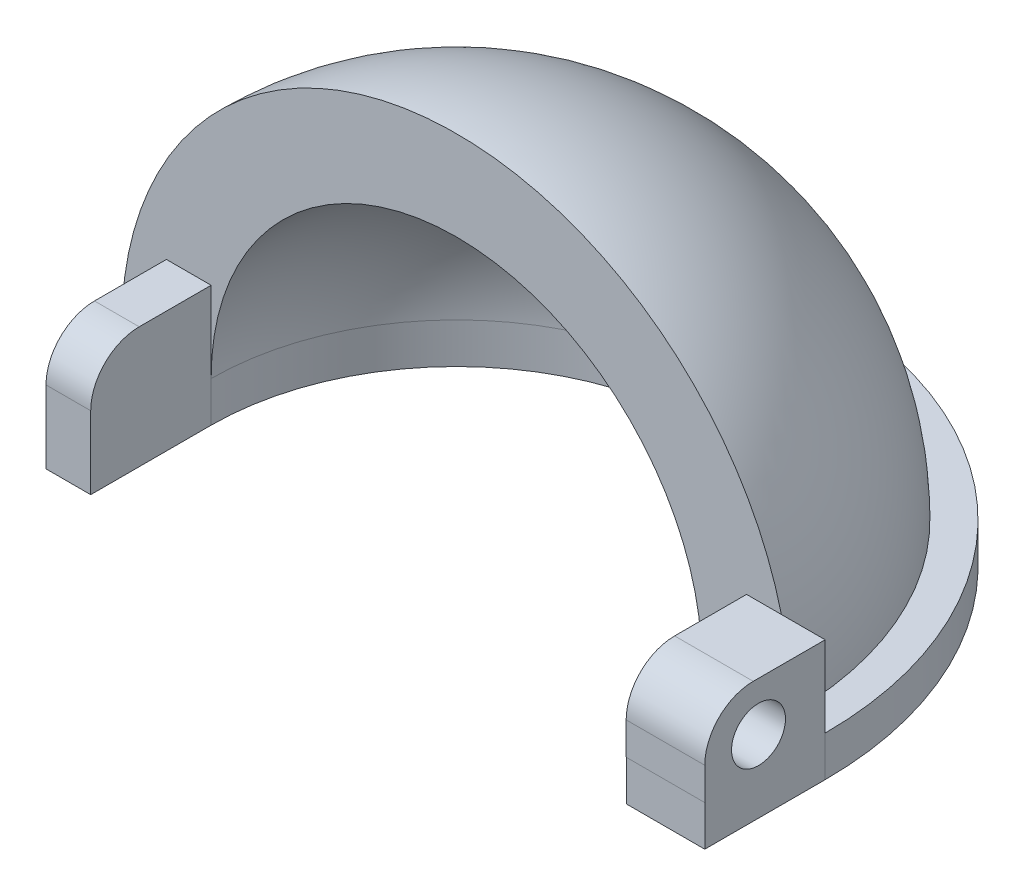
ISO-10303-21;
HEADER;
FILE_DESCRIPTION(('STEP AP214'),'2;1');
FILE_NAME('part.step','',(''),(''),'','','');
FILE_SCHEMA(('AUTOMOTIVE_DESIGN { 1 0 10303 214 1 1 1 1 }'));
ENDSEC;
DATA;
#1=APPLICATION_CONTEXT('core data for automotive mechanical design processes');
#2=APPLICATION_PROTOCOL_DEFINITION('international standard','automotive_design',2000,#1);
#3=PRODUCT_CONTEXT('',#1,'mechanical');
#4=PRODUCT('Part','Part','',(#3));
#5=PRODUCT_RELATED_PRODUCT_CATEGORY('part','',(#4));
#6=PRODUCT_DEFINITION_FORMATION('','',#4);
#7=PRODUCT_DEFINITION_CONTEXT('part definition',#1,'design');
#8=PRODUCT_DEFINITION('design','',#6,#7);
#9=PRODUCT_DEFINITION_SHAPE('','',#8);
#10=(LENGTH_UNIT() NAMED_UNIT(*) SI_UNIT(.MILLI.,.METRE.));
#11=(NAMED_UNIT(*) PLANE_ANGLE_UNIT() SI_UNIT($,.RADIAN.));
#12=(NAMED_UNIT(*) SI_UNIT($,.STERADIAN.) SOLID_ANGLE_UNIT());
#13=UNCERTAINTY_MEASURE_WITH_UNIT(LENGTH_MEASURE(1.E-05),#10,'distance_accuracy_value','');
#14=(GEOMETRIC_REPRESENTATION_CONTEXT(3) GLOBAL_UNCERTAINTY_ASSIGNED_CONTEXT((#13)) GLOBAL_UNIT_ASSIGNED_CONTEXT((#10,
#11,#12)) REPRESENTATION_CONTEXT('',''));
#15=CARTESIAN_POINT('',(0.,0.,0.));
#16=DIRECTION('',(0.,0.,1.));
#17=DIRECTION('',(1.,0.,0.));
#18=AXIS2_PLACEMENT_3D('',#15,#16,#17);
#19=CARTESIAN_POINT('',(0.,4.572,4.52200274069132));
#20=DIRECTION('',(-1.,0.,0.));
#21=DIRECTION('',(0.,0.,1.));
#22=AXIS2_PLACEMENT_3D('',#19,#20,#21);
#23=CYLINDRICAL_SURFACE('',#22,3.048);
#24=DIRECTION('',(-1.,0.,0.));
#25=VECTOR('',#24,1.);
#26=CARTESIAN_POINT('',(0.,4.572,7.57000274069132));
#27=LINE('',#26,#25);
#28=CARTESIAN_POINT('',(7.81129479264564,4.572,7.57000274069132));
#29=VERTEX_POINT('',#28);
#30=CARTESIAN_POINT('',(4.99931890190691,4.572,7.57000274069132));
#31=VERTEX_POINT('',#30);
#32=EDGE_CURVE('E162',#29,#31,#27,.T.);
#33=ORIENTED_EDGE('',*,*,#32,.F.);
#34=CARTESIAN_POINT('',(7.81129479264564,4.572,4.52200274069132));
#35=DIRECTION('',(-1.,0.,0.));
#36=DIRECTION('',(0.,0.,1.));
#37=AXIS2_PLACEMENT_3D('',#34,#35,#36);
#38=CIRCLE('',#37,3.048);
#39=CARTESIAN_POINT('',(7.81129479264564,7.62,4.52200274069132));
#40=VERTEX_POINT('',#39);
#41=EDGE_CURVE('E42',#40,#29,#38,.F.);
#42=ORIENTED_EDGE('',*,*,#41,.F.);
#43=DIRECTION('',(-1.,0.,0.));
#44=VECTOR('',#43,1.);
#45=CARTESIAN_POINT('',(0.,7.62,4.52200274069132));
#46=LINE('',#45,#44);
#47=CARTESIAN_POINT('',(4.99931890190691,7.62,4.52200274069132));
#48=VERTEX_POINT('',#47);
#49=EDGE_CURVE('E228',#48,#40,#46,.F.);
#50=ORIENTED_EDGE('',*,*,#49,.F.);
#51=CARTESIAN_POINT('',(4.99931890190691,4.572,4.52200274069132));
#52=DIRECTION('',(1.,0.,0.));
#53=DIRECTION('',(0.,0.,-1.));
#54=AXIS2_PLACEMENT_3D('',#51,#52,#53);
#55=CIRCLE('',#54,3.048);
#56=EDGE_CURVE('E11',#31,#48,#55,.F.);
#57=ORIENTED_EDGE('',*,*,#56,.F.);
#58=EDGE_LOOP('',(#33,#42,#50,#57));
#59=FACE_BOUND('',#58,.T.);
#60=ADVANCED_FACE('F35',(#59),#23,.T.);
#61=CARTESIAN_POINT('',(0.,7.62,0.));
#62=DIRECTION('',(0.,-1.,0.));
#63=DIRECTION('',(0.,0.,-1.));
#64=AXIS2_PLACEMENT_3D('',#61,#62,#63);
#65=PLANE('',#64);
#66=DIRECTION('',(0.,0.,-1.));
#67=VECTOR('',#66,1.);
#68=CARTESIAN_POINT('',(4.99931890190691,7.62,7.57000274069132));
#69=LINE('',#68,#67);
#70=CARTESIAN_POINT('',(4.99931890190691,7.62,0.));
#71=VERTEX_POINT('',#70);
#72=EDGE_CURVE('E239',#48,#71,#69,.T.);
#73=ORIENTED_EDGE('',*,*,#72,.F.);
#74=ORIENTED_EDGE('',*,*,#49,.T.);
#75=DIRECTION('',(0.,0.,-1.));
#76=VECTOR('',#75,1.);
#77=CARTESIAN_POINT('',(7.81129479264564,7.62,7.57000274069132));
#78=LINE('',#77,#76);
#79=CARTESIAN_POINT('',(7.81129479264564,7.62,1.22670333591582E-12));
#80=VERTEX_POINT('',#79);
#81=EDGE_CURVE('E233',#40,#80,#78,.T.);
#82=ORIENTED_EDGE('',*,*,#81,.T.);
#83=DIRECTION('',(-1.,0.,0.));
#84=VECTOR('',#83,1.);
#85=CARTESIAN_POINT('',(4.99931890190692,7.62,0.));
#86=LINE('',#85,#84);
#87=EDGE_CURVE('E277',#80,#71,#86,.T.);
#88=ORIENTED_EDGE('',*,*,#87,.T.);
#89=EDGE_LOOP('',(#73,#74,#82,#88));
#90=FACE_BOUND('',#89,.T.);
#91=ADVANCED_FACE('F381',(#90),#65,.F.);
#92=CARTESIAN_POINT('',(23.2385388906228,2.54000000000064,6.34041430469523E-13));
#93=DIRECTION('',(0.,0.,-1.));
#94=DIRECTION('',(0.,1.,0.));
#95=AXIS2_PLACEMENT_3D('',#92,#93,#94);
#96=PLANE('',#95);
#97=DIRECTION('',(0.,1.,0.));
#98=VECTOR('',#97,1.);
#99=CARTESIAN_POINT('',(7.81129479264564,2.54000000000064,1.11759969667996E-12));
#100=LINE('',#99,#98);
#101=CARTESIAN_POINT('',(7.81129479264564,2.54,6.34041430469523E-13));
#102=VERTEX_POINT('',#101);
#103=EDGE_CURVE('E243',#102,#80,#100,.T.);
#104=ORIENTED_EDGE('',*,*,#103,.F.);
#105=CARTESIAN_POINT('',(23.2380511651513,2.54000000000064,6.34041430469523E-13));
#106=DIRECTION('',(0.,0.,-1.));
#107=DIRECTION('',(0.,-1.,0.));
#108=AXIS2_PLACEMENT_3D('',#105,#106,#107);
#109=CIRCLE('',#108,15.4267563725057);
#110=CARTESIAN_POINT('',(38.664807537657,2.54,6.34041430469523E-13));
#111=VERTEX_POINT('',#110);
#112=EDGE_CURVE('E308',#102,#111,#109,.T.);
#113=ORIENTED_EDGE('',*,*,#112,.T.);
#114=DIRECTION('',(1.,0.,0.));
#115=VECTOR('',#114,1.);
#116=CARTESIAN_POINT('',(38.664807537657,2.54,1.50487261540988E-13));
#117=LINE('',#116,#115);
#118=CARTESIAN_POINT('',(41.4772711538672,2.54,0.));
#119=VERTEX_POINT('',#118);
#120=EDGE_CURVE('E187',#111,#119,#117,.T.);
#121=ORIENTED_EDGE('',*,*,#120,.T.);
#122=DIRECTION('',(0.,-1.,0.));
#123=VECTOR('',#122,1.);
#124=CARTESIAN_POINT('',(41.4772711538672,7.62,0.));
#125=LINE('',#124,#123);
#126=CARTESIAN_POINT('',(41.4772711538672,7.62,0.));
#127=VERTEX_POINT('',#126);
#128=EDGE_CURVE('E296',#127,#119,#125,.T.);
#129=ORIENTED_EDGE('',*,*,#128,.F.);
#130=DIRECTION('',(1.,0.,0.));
#131=VECTOR('',#130,1.);
#132=CARTESIAN_POINT('',(23.2385388906228,7.62,7.43145069705384E-13));
#133=LINE('',#132,#131);
#134=CARTESIAN_POINT('',(43.6675978007922,7.62,1.02807738930427E-13));
#135=VERTEX_POINT('',#134);
#136=EDGE_CURVE('E209',#127,#135,#133,.T.);
#137=ORIENTED_EDGE('',*,*,#136,.T.);
#138=CARTESIAN_POINT('',(23.2385388906228,2.54000000000064,6.34041430469523E-13));
#139=DIRECTION('',(0.,0.,1.));
#140=DIRECTION('',(0.,1.,0.));
#141=AXIS2_PLACEMENT_3D('',#138,#139,#140);
#142=CIRCLE('',#141,21.0511958794546);
#143=CARTESIAN_POINT('',(2.18734301116819,2.54,0.));
#144=VERTEX_POINT('',#143);
#145=EDGE_CURVE('E304',#135,#144,#142,.T.);
#146=ORIENTED_EDGE('',*,*,#145,.T.);
#147=DIRECTION('',(-1.,0.,0.));
#148=VECTOR('',#147,1.);
#149=CARTESIAN_POINT('',(4.99931890190692,2.54,0.));
#150=LINE('',#149,#148);
#151=CARTESIAN_POINT('',(0.,2.54,0.));
#152=VERTEX_POINT('',#151);
#153=EDGE_CURVE('E276',#144,#152,#150,.T.);
#154=ORIENTED_EDGE('',*,*,#153,.T.);
#155=DIRECTION('',(0.,-1.,0.));
#156=VECTOR('',#155,1.);
#157=CARTESIAN_POINT('',(0.,2.54,0.));
#158=LINE('',#157,#156);
#159=CARTESIAN_POINT('',(0.,0.,0.));
#160=VERTEX_POINT('',#159);
#161=EDGE_CURVE('E207',#152,#160,#158,.T.);
#162=ORIENTED_EDGE('',*,*,#161,.T.);
#163=DIRECTION('',(-1.,0.,0.));
#164=VECTOR('',#163,1.);
#165=CARTESIAN_POINT('',(0.,0.,0.));
#166=LINE('',#165,#164);
#167=CARTESIAN_POINT('',(4.99931890190691,0.,0.));
#168=VERTEX_POINT('',#167);
#169=EDGE_CURVE('E174',#168,#160,#166,.T.);
#170=ORIENTED_EDGE('',*,*,#169,.F.);
#171=DIRECTION('',(0.,1.,0.));
#172=VECTOR('',#171,1.);
#173=CARTESIAN_POINT('',(4.99931890190691,0.,0.));
#174=LINE('',#173,#172);
#175=EDGE_CURVE('E170',#168,#71,#174,.T.);
#176=ORIENTED_EDGE('',*,*,#175,.T.);
#177=ORIENTED_EDGE('',*,*,#87,.F.);
#178=EDGE_LOOP('',(#104,#113,#121,#129,#137,#146,#154,#162,#170,#176,#177));
#179=FACE_BOUND('',#178,.T.);
#180=ADVANCED_FACE('F323',(#179),#96,.F.);
#181=CARTESIAN_POINT('',(38.664807537657,4.572,4.52200274069132));
#182=DIRECTION('',(1.,0.,0.));
#183=DIRECTION('',(0.,0.,-1.));
#184=AXIS2_PLACEMENT_3D('',#181,#182,#183);
#185=CYLINDRICAL_SURFACE('',#184,3.048);
#186=DIRECTION('',(-1.,0.,0.));
#187=VECTOR('',#186,1.);
#188=CARTESIAN_POINT('',(38.664807537657,4.572,7.57000274069132));
#189=LINE('',#188,#187);
#190=CARTESIAN_POINT('',(46.4199382394668,4.572,7.57000274069132));
#191=VERTEX_POINT('',#190);
#192=CARTESIAN_POINT('',(41.4772711538672,4.572,7.57000274069132));
#193=VERTEX_POINT('',#192);
#194=EDGE_CURVE('E217',#191,#193,#189,.T.);
#195=ORIENTED_EDGE('',*,*,#194,.F.);
#196=CARTESIAN_POINT('',(46.4199382394668,4.572,4.52200274069132));
#197=DIRECTION('',(-1.,0.,0.));
#198=DIRECTION('',(0.,0.,1.));
#199=AXIS2_PLACEMENT_3D('',#196,#197,#198);
#200=CIRCLE('',#199,3.048);
#201=CARTESIAN_POINT('',(46.4199382394668,7.62,4.52200274069132));
#202=VERTEX_POINT('',#201);
#203=EDGE_CURVE('E223',#202,#191,#200,.F.);
#204=ORIENTED_EDGE('',*,*,#203,.F.);
#205=DIRECTION('',(-1.,0.,0.));
#206=VECTOR('',#205,1.);
#207=CARTESIAN_POINT('',(38.664807537657,7.62,4.52200274069132));
#208=LINE('',#207,#206);
#209=CARTESIAN_POINT('',(41.4772711538672,7.62,4.52200274069132));
#210=VERTEX_POINT('',#209);
#211=EDGE_CURVE('E220',#210,#202,#208,.F.);
#212=ORIENTED_EDGE('',*,*,#211,.F.);
#213=CARTESIAN_POINT('',(41.4772711538672,4.572,4.52200274069132));
#214=DIRECTION('',(1.,0.,0.));
#215=DIRECTION('',(0.,0.,-1.));
#216=AXIS2_PLACEMENT_3D('',#213,#214,#215);
#217=CIRCLE('',#216,3.048);
#218=EDGE_CURVE('E225',#193,#210,#217,.F.);
#219=ORIENTED_EDGE('',*,*,#218,.F.);
#220=EDGE_LOOP('',(#195,#204,#212,#219));
#221=FACE_BOUND('',#220,.T.);
#222=ADVANCED_FACE('F390',(#221),#185,.T.);
#223=CARTESIAN_POINT('',(38.664807537657,2.54,7.57000274069132));
#224=DIRECTION('',(0.,0.,-1.));
#225=DIRECTION('',(-1.,0.,0.));
#226=AXIS2_PLACEMENT_3D('',#223,#224,#225);
#227=PLANE('',#226);
#228=DIRECTION('',(1.,0.,0.));
#229=VECTOR('',#228,1.);
#230=CARTESIAN_POINT('',(38.664807537657,2.54,7.57000274069132));
#231=LINE('',#230,#229);
#232=CARTESIAN_POINT('',(41.4977628366429,2.54,7.57000274069132));
#233=VERTEX_POINT('',#232);
#234=CARTESIAN_POINT('',(46.4199382394668,2.54,7.57000274069132));
#235=VERTEX_POINT('',#234);
#236=EDGE_CURVE('E212',#233,#235,#231,.T.);
#237=ORIENTED_EDGE('',*,*,#236,.F.);
#238=DIRECTION('',(0.,1.,0.));
#239=VECTOR('',#238,1.);
#240=CARTESIAN_POINT('',(41.4977628366429,2.54,7.57000274069132));
#241=LINE('',#240,#239);
#242=CARTESIAN_POINT('',(41.4977628366429,0.,7.57000274069132));
#243=VERTEX_POINT('',#242);
#244=EDGE_CURVE('E245',#243,#233,#241,.T.);
#245=ORIENTED_EDGE('',*,*,#244,.F.);
#246=DIRECTION('',(1.,0.,0.));
#247=VECTOR('',#246,1.);
#248=CARTESIAN_POINT('',(38.664807537657,0.,7.57000274069132));
#249=LINE('',#248,#247);
#250=CARTESIAN_POINT('',(46.4199382394668,0.,7.57000274069132));
#251=VERTEX_POINT('',#250);
#252=EDGE_CURVE('E184',#243,#251,#249,.T.);
#253=ORIENTED_EDGE('',*,*,#252,.T.);
#254=DIRECTION('',(0.,-1.,0.));
#255=VECTOR('',#254,1.);
#256=CARTESIAN_POINT('',(46.4199382394668,2.54,7.57000274069132));
#257=LINE('',#256,#255);
#258=EDGE_CURVE('E198',#235,#251,#257,.T.);
#259=ORIENTED_EDGE('',*,*,#258,.F.);
#260=EDGE_LOOP('',(#237,#245,#253,#259));
#261=FACE_BOUND('',#260,.T.);
#262=ADVANCED_FACE('F368',(#261),#227,.F.);
#263=CARTESIAN_POINT('',(23.2099691197334,2.54,0.));
#264=DIRECTION('',(0.,-1.,0.));
#265=DIRECTION('',(0.,0.,-1.));
#266=AXIS2_PLACEMENT_3D('',#263,#264,#265);
#267=PLANE('',#266);
#268=ORIENTED_EDGE('',*,*,#153,.F.);
#269=CARTESIAN_POINT('',(23.2385388906228,2.54,0.));
#270=DIRECTION('',(0.,1.,0.));
#271=DIRECTION('',(0.,0.,-1.));
#272=AXIS2_PLACEMENT_3D('',#269,#270,#271);
#273=CIRCLE('',#272,21.0511958794546);
#274=CARTESIAN_POINT('',(44.2897347700774,2.54,0.));
#275=VERTEX_POINT('',#274);
#276=EDGE_CURVE('E301',#275,#144,#273,.T.);
#277=ORIENTED_EDGE('',*,*,#276,.F.);
#278=DIRECTION('',(-1.,0.,0.));
#279=VECTOR('',#278,1.);
#280=CARTESIAN_POINT('',(46.4199382394668,2.54,0.));
#281=LINE('',#280,#279);
#282=CARTESIAN_POINT('',(46.4199382394668,2.54,0.));
#283=VERTEX_POINT('',#282);
#284=EDGE_CURVE('E280',#283,#275,#281,.T.);
#285=ORIENTED_EDGE('',*,*,#284,.F.);
#286=CARTESIAN_POINT('',(23.2099691197334,2.54,0.));
#287=DIRECTION('',(0.,1.,0.));
#288=DIRECTION('',(0.,0.,-1.));
#289=AXIS2_PLACEMENT_3D('',#286,#287,#288);
#290=CIRCLE('',#289,23.2099691197334);
#291=EDGE_CURVE('E194',#283,#152,#290,.T.);
#292=ORIENTED_EDGE('',*,*,#291,.T.);
#293=EDGE_LOOP('',(#268,#277,#285,#292));
#294=FACE_BOUND('',#293,.T.);
#295=ADVANCED_FACE('F350',(#294),#267,.F.);
#296=CARTESIAN_POINT('',(23.2099691197334,2.54,0.));
#297=DIRECTION('',(0.,-1.,0.));
#298=DIRECTION('',(0.,0.,-1.));
#299=AXIS2_PLACEMENT_3D('',#296,#297,#298);
#300=CYLINDRICAL_SURFACE('',#299,23.2099691197334);
#301=CARTESIAN_POINT('',(23.2099691197334,0.,0.));
#302=DIRECTION('',(0.,1.,0.));
#303=DIRECTION('',(0.,0.,-1.));
#304=AXIS2_PLACEMENT_3D('',#301,#302,#303);
#305=CIRCLE('',#304,23.2099691197334);
#306=CARTESIAN_POINT('',(46.4199382394668,0.,0.));
#307=VERTEX_POINT('',#306);
#308=EDGE_CURVE('E181',#307,#160,#305,.T.);
#309=ORIENTED_EDGE('',*,*,#308,.T.);
#310=ORIENTED_EDGE('',*,*,#161,.F.);
#311=ORIENTED_EDGE('',*,*,#291,.F.);
#312=DIRECTION('',(0.,-1.,0.));
#313=VECTOR('',#312,1.);
#314=CARTESIAN_POINT('',(46.4199382394668,2.54,0.));
#315=LINE('',#314,#313);
#316=EDGE_CURVE('E195',#283,#307,#315,.T.);
#317=ORIENTED_EDGE('',*,*,#316,.T.);
#318=EDGE_LOOP('',(#309,#310,#311,#317));
#319=FACE_BOUND('',#318,.T.);
#320=ADVANCED_FACE('F356',(#319),#300,.T.);
#321=CARTESIAN_POINT('',(0.,2.54,7.57000274069132));
#322=DIRECTION('',(0.,0.,-1.));
#323=DIRECTION('',(-1.,0.,0.));
#324=AXIS2_PLACEMENT_3D('',#321,#322,#323);
#325=PLANE('',#324);
#326=DIRECTION('',(0.,1.,0.));
#327=VECTOR('',#326,1.);
#328=CARTESIAN_POINT('',(7.81129479264564,0.,7.57000274069132));
#329=LINE('',#328,#327);
#330=CARTESIAN_POINT('',(7.81129479264564,0.,7.57000274069132));
#331=VERTEX_POINT('',#330);
#332=EDGE_CURVE('E164',#331,#29,#329,.T.);
#333=ORIENTED_EDGE('',*,*,#332,.T.);
#334=ORIENTED_EDGE('',*,*,#32,.T.);
#335=DIRECTION('',(0.,-1.,0.));
#336=VECTOR('',#335,1.);
#337=CARTESIAN_POINT('',(4.99931890190691,0.,7.57000274069132));
#338=LINE('',#337,#336);
#339=CARTESIAN_POINT('',(4.99931890190691,0.,7.57000274069132));
#340=VERTEX_POINT('',#339);
#341=EDGE_CURVE('E155',#31,#340,#338,.T.);
#342=ORIENTED_EDGE('',*,*,#341,.T.);
#343=DIRECTION('',(1.,0.,0.));
#344=VECTOR('',#343,1.);
#345=CARTESIAN_POINT('',(0.,0.,7.57000274069132));
#346=LINE('',#345,#344);
#347=EDGE_CURVE('E160',#340,#331,#346,.T.);
#348=ORIENTED_EDGE('',*,*,#347,.T.);
#349=EDGE_LOOP('',(#333,#334,#342,#348));
#350=FACE_BOUND('',#349,.T.);
#351=ADVANCED_FACE('F158',(#350),#325,.F.);
#352=CARTESIAN_POINT('',(23.2380511651513,2.54,0.));
#353=DIRECTION('',(0.,-1.,0.));
#354=DIRECTION('',(0.,0.,-1.));
#355=AXIS2_PLACEMENT_3D('',#352,#353,#354);
#356=CYLINDRICAL_SURFACE('',#355,15.4267563725057);
#357=CARTESIAN_POINT('',(23.2380511651513,0.,0.));
#358=DIRECTION('',(0.,-1.,0.));
#359=DIRECTION('',(0.,0.,-1.));
#360=AXIS2_PLACEMENT_3D('',#357,#358,#359);
#361=CIRCLE('',#360,15.4267563725057);
#362=CARTESIAN_POINT('',(7.81129479264564,0.,0.));
#363=VERTEX_POINT('',#362);
#364=CARTESIAN_POINT('',(38.664807537657,0.,0.));
#365=VERTEX_POINT('',#364);
#366=EDGE_CURVE('E180',#363,#365,#361,.T.);
#367=ORIENTED_EDGE('',*,*,#366,.T.);
#368=DIRECTION('',(0.,-1.,0.));
#369=VECTOR('',#368,1.);
#370=CARTESIAN_POINT('',(38.664807537657,2.54,1.50668790599245E-13));
#371=LINE('',#370,#369);
#372=EDGE_CURVE('E203',#111,#365,#371,.T.);
#373=ORIENTED_EDGE('',*,*,#372,.F.);
#374=CARTESIAN_POINT('',(23.2380511651513,2.54,0.));
#375=DIRECTION('',(0.,-1.,0.));
#376=DIRECTION('',(0.,0.,-1.));
#377=AXIS2_PLACEMENT_3D('',#374,#375,#376);
#378=CIRCLE('',#377,15.4267563725057);
#379=EDGE_CURVE('E199',#102,#111,#378,.T.);
#380=ORIENTED_EDGE('',*,*,#379,.F.);
#381=DIRECTION('',(0.,-1.,0.));
#382=VECTOR('',#381,1.);
#383=CARTESIAN_POINT('',(7.81129479264564,2.54,-1.78053101776432E-13));
#384=LINE('',#383,#382);
#385=EDGE_CURVE('E205',#102,#363,#384,.T.);
#386=ORIENTED_EDGE('',*,*,#385,.T.);
#387=EDGE_LOOP('',(#367,#373,#380,#386));
#388=FACE_BOUND('',#387,.T.);
#389=ADVANCED_FACE('F326',(#388),#356,.F.);
#390=EDGE_CURVE('E200',#191,#235,#257,.T.);
#391=ORIENTED_EDGE('',*,*,#390,.F.);
#392=ORIENTED_EDGE('',*,*,#194,.T.);
#393=DIRECTION('',(0.,-1.,0.));
#394=VECTOR('',#393,1.);
#395=CARTESIAN_POINT('',(41.4772711538672,7.62,7.57000274069132));
#396=LINE('',#395,#394);
#397=CARTESIAN_POINT('',(41.4772711538672,2.54,7.57000274069132));
#398=VERTEX_POINT('',#397);
#399=EDGE_CURVE('E290',#193,#398,#396,.T.);
#400=ORIENTED_EDGE('',*,*,#399,.T.);
#401=EDGE_CURVE('E213',#398,#233,#231,.T.);
#402=ORIENTED_EDGE('',*,*,#401,.T.);
#403=ORIENTED_EDGE('',*,*,#236,.T.);
#404=EDGE_LOOP('',(#391,#392,#400,#402,#403));
#405=FACE_BOUND('',#404,.T.);
#406=ADVANCED_FACE('F416',(#405),#227,.F.);
#407=CARTESIAN_POINT('',(46.4199382394668,2.54,7.57000274069132));
#408=DIRECTION('',(-1.,0.,0.));
#409=DIRECTION('',(0.,0.,1.));
#410=AXIS2_PLACEMENT_3D('',#407,#408,#409);
#411=PLANE('',#410);
#412=CARTESIAN_POINT('',(46.4199382394668,4.56032514768533,4.19221866771495));
#413=DIRECTION('',(1.,0.,0.));
#414=DIRECTION('',(0.,0.,-1.));
#415=AXIS2_PLACEMENT_3D('',#412,#413,#414);
#416=CIRCLE('',#415,1.69551181155846);
#417=CARTESIAN_POINT('',(46.4199382394668,4.56032514768533,2.49670685615649));
#418=VERTEX_POINT('',#417);
#419=EDGE_CURVE('E264',#418,#418,#416,.T.);
#420=ORIENTED_EDGE('',*,*,#419,.F.);
#421=EDGE_LOOP('',(#420));
#422=FACE_BOUND('',#421,.T.);
#423=DIRECTION('',(0.,0.,-1.));
#424=VECTOR('',#423,1.);
#425=CARTESIAN_POINT('',(46.4199382394668,7.62,7.57000274069132));
#426=LINE('',#425,#424);
#427=CARTESIAN_POINT('',(46.4199382394668,7.62,0.));
#428=VERTEX_POINT('',#427);
#429=EDGE_CURVE('E282',#202,#428,#426,.T.);
#430=ORIENTED_EDGE('',*,*,#429,.F.);
#431=ORIENTED_EDGE('',*,*,#203,.T.);
#432=ORIENTED_EDGE('',*,*,#390,.T.);
#433=ORIENTED_EDGE('',*,*,#258,.T.);
#434=DIRECTION('',(0.,0.,-1.));
#435=VECTOR('',#434,1.);
#436=CARTESIAN_POINT('',(46.4199382394668,0.,7.57000274069132));
#437=LINE('',#436,#435);
#438=EDGE_CURVE('E192',#251,#307,#437,.T.);
#439=ORIENTED_EDGE('',*,*,#438,.T.);
#440=ORIENTED_EDGE('',*,*,#316,.F.);
#441=DIRECTION('',(0.,-1.,0.));
#442=VECTOR('',#441,1.);
#443=CARTESIAN_POINT('',(46.4199382394668,7.62,0.));
#444=LINE('',#443,#442);
#445=EDGE_CURVE('E299',#428,#283,#444,.T.);
#446=ORIENTED_EDGE('',*,*,#445,.F.);
#447=EDGE_LOOP('',(#430,#431,#432,#433,#439,#440,#446));
#448=FACE_BOUND('',#447,.T.);
#449=ADVANCED_FACE('F361',(#422,#448),#411,.F.);
#450=CARTESIAN_POINT('',(23.2099691197334,0.,0.));
#451=DIRECTION('',(0.,-1.,0.));
#452=DIRECTION('',(0.,0.,-1.));
#453=AXIS2_PLACEMENT_3D('',#450,#451,#452);
#454=PLANE('',#453);
#455=ORIENTED_EDGE('',*,*,#169,.T.);
#456=ORIENTED_EDGE('',*,*,#308,.F.);
#457=ORIENTED_EDGE('',*,*,#438,.F.);
#458=ORIENTED_EDGE('',*,*,#252,.F.);
#459=DIRECTION('',(0.,0.,1.));
#460=VECTOR('',#459,1.);
#461=CARTESIAN_POINT('',(41.4977628366429,0.,-0.0499972593086982));
#462=LINE('',#461,#460);
#463=CARTESIAN_POINT('',(41.4977628366429,0.,-0.0499972593086982));
#464=VERTEX_POINT('',#463);
#465=EDGE_CURVE('E267',#464,#243,#462,.T.);
#466=ORIENTED_EDGE('',*,*,#465,.F.);
#467=DIRECTION('',(1.,0.,0.));
#468=VECTOR('',#467,1.);
#469=CARTESIAN_POINT('',(38.664807537657,0.,-0.0499972593086982));
#470=LINE('',#469,#468);
#471=CARTESIAN_POINT('',(38.664807537657,0.,-0.0499972593086982));
#472=VERTEX_POINT('',#471);
#473=EDGE_CURVE('E249',#472,#464,#470,.T.);
#474=ORIENTED_EDGE('',*,*,#473,.F.);
#475=DIRECTION('',(0.,0.,1.));
#476=VECTOR('',#475,1.);
#477=CARTESIAN_POINT('',(38.664807537657,0.,-0.0499972593086982));
#478=LINE('',#477,#476);
#479=EDGE_CURVE('E258',#472,#365,#478,.T.);
#480=ORIENTED_EDGE('',*,*,#479,.T.);
#481=ORIENTED_EDGE('',*,*,#366,.F.);
#482=DIRECTION('',(0.,0.,-1.));
#483=VECTOR('',#482,1.);
#484=CARTESIAN_POINT('',(7.81129479264564,0.,7.57000274069132));
#485=LINE('',#484,#483);
#486=EDGE_CURVE('E163',#331,#363,#485,.T.);
#487=ORIENTED_EDGE('',*,*,#486,.F.);
#488=ORIENTED_EDGE('',*,*,#347,.F.);
#489=DIRECTION('',(0.,0.,-1.));
#490=VECTOR('',#489,1.);
#491=CARTESIAN_POINT('',(4.99931890190691,0.,0.));
#492=LINE('',#491,#490);
#493=EDGE_CURVE('E167',#340,#168,#492,.T.);
#494=ORIENTED_EDGE('',*,*,#493,.T.);
#495=EDGE_LOOP('',(#455,#456,#457,#458,#466,#474,#480,#481,#487,#488,#494));
#496=FACE_BOUND('',#495,.T.);
#497=ADVANCED_FACE('F176',(#496),#454,.T.);
#498=CARTESIAN_POINT('',(23.2385388906228,2.54000000000064,6.34041430469523E-13));
#499=DIRECTION('',(-1.,0.,0.));
#500=DIRECTION('',(0.,-1.,0.));
#501=AXIS2_PLACEMENT_3D('',#498,#499,#500);
#502=SPHERICAL_SURFACE('',#501,21.0511958794546);
#503=ORIENTED_EDGE('',*,*,#276,.T.);
#504=ORIENTED_EDGE('',*,*,#145,.F.);
#505=EDGE_CURVE('E305',#275,#135,#142,.T.);
#506=ORIENTED_EDGE('',*,*,#505,.F.);
#507=EDGE_LOOP('',(#503,#504,#506));
#508=FACE_BOUND('',#507,.T.);
#509=ADVANCED_FACE('F345',(#508),#502,.T.);
#510=CARTESIAN_POINT('',(23.2380511651513,2.54000000000064,6.34041430469523E-13));
#511=DIRECTION('',(-1.,0.,0.));
#512=DIRECTION('',(0.,1.,0.));
#513=AXIS2_PLACEMENT_3D('',#510,#511,#512);
#514=SPHERICAL_SURFACE('',#513,15.4267563725057);
#515=ORIENTED_EDGE('',*,*,#379,.T.);
#516=ORIENTED_EDGE('',*,*,#112,.F.);
#517=EDGE_LOOP('',(#515,#516));
#518=FACE_BOUND('',#517,.T.);
#519=ADVANCED_FACE('F318',(#518),#514,.F.);
#520=CARTESIAN_POINT('',(46.4199382394668,7.62,0.));
#521=DIRECTION('',(0.,0.,1.));
#522=DIRECTION('',(1.,0.,0.));
#523=AXIS2_PLACEMENT_3D('',#520,#521,#522);
#524=PLANE('',#523);
#525=ORIENTED_EDGE('',*,*,#284,.T.);
#526=ORIENTED_EDGE('',*,*,#505,.T.);
#527=DIRECTION('',(-1.,0.,0.));
#528=VECTOR('',#527,1.);
#529=CARTESIAN_POINT('',(46.4199382394668,7.62,0.));
#530=LINE('',#529,#528);
#531=EDGE_CURVE('E284',#428,#135,#530,.T.);
#532=ORIENTED_EDGE('',*,*,#531,.F.);
#533=ORIENTED_EDGE('',*,*,#445,.T.);
#534=EDGE_LOOP('',(#525,#526,#532,#533));
#535=FACE_BOUND('',#534,.T.);
#536=ADVANCED_FACE('F401',(#535),#524,.F.);
#537=CARTESIAN_POINT('',(41.4772711538672,7.62,7.57000274069132));
#538=DIRECTION('',(1.,0.,0.));
#539=DIRECTION('',(0.,0.,-1.));
#540=AXIS2_PLACEMENT_3D('',#537,#538,#539);
#541=PLANE('',#540);
#542=CARTESIAN_POINT('',(41.4772711538672,4.56032514768533,4.19221866771495));
#543=DIRECTION('',(1.,0.,0.));
#544=DIRECTION('',(0.,0.,-1.));
#545=AXIS2_PLACEMENT_3D('',#542,#543,#544);
#546=CIRCLE('',#545,1.69551181155846);
#547=CARTESIAN_POINT('',(41.4772711538672,4.56032514768533,2.49670685615649));
#548=VERTEX_POINT('',#547);
#549=EDGE_CURVE('E273',#548,#548,#546,.T.);
#550=ORIENTED_EDGE('',*,*,#549,.T.);
#551=EDGE_LOOP('',(#550));
#552=FACE_BOUND('',#551,.T.);
#553=ORIENTED_EDGE('',*,*,#399,.F.);
#554=ORIENTED_EDGE('',*,*,#218,.T.);
#555=DIRECTION('',(0.,0.,1.));
#556=VECTOR('',#555,1.);
#557=CARTESIAN_POINT('',(41.4772711538672,7.62,7.57000274069132));
#558=LINE('',#557,#556);
#559=EDGE_CURVE('E287',#127,#210,#558,.T.);
#560=ORIENTED_EDGE('',*,*,#559,.F.);
#561=ORIENTED_EDGE('',*,*,#128,.T.);
#562=DIRECTION('',(0.,0.,1.));
#563=VECTOR('',#562,1.);
#564=CARTESIAN_POINT('',(41.4772711538672,2.54,7.57000274069132));
#565=LINE('',#564,#563);
#566=EDGE_CURVE('E285',#119,#398,#565,.T.);
#567=ORIENTED_EDGE('',*,*,#566,.T.);
#568=EDGE_LOOP('',(#553,#554,#560,#561,#567));
#569=FACE_BOUND('',#568,.T.);
#570=ADVANCED_FACE('F340',(#552,#569),#541,.F.);
#571=CARTESIAN_POINT('',(0.,7.62,0.));
#572=DIRECTION('',(0.,1.,0.));
#573=DIRECTION('',(0.,0.,1.));
#574=AXIS2_PLACEMENT_3D('',#571,#572,#573);
#575=PLANE('',#574);
#576=ORIENTED_EDGE('',*,*,#559,.T.);
#577=ORIENTED_EDGE('',*,*,#211,.T.);
#578=ORIENTED_EDGE('',*,*,#429,.T.);
#579=ORIENTED_EDGE('',*,*,#531,.T.);
#580=ORIENTED_EDGE('',*,*,#136,.F.);
#581=EDGE_LOOP('',(#576,#577,#578,#579,#580));
#582=FACE_BOUND('',#581,.T.);
#583=ADVANCED_FACE('F396',(#582),#575,.T.);
#584=CARTESIAN_POINT('',(-4.12606176053326,4.56032514768533,4.19221866771495));
#585=DIRECTION('',(1.,0.,0.));
#586=DIRECTION('',(0.,0.,-1.));
#587=AXIS2_PLACEMENT_3D('',#584,#585,#586);
#588=CYLINDRICAL_SURFACE('',#587,1.69551181155846);
#589=ORIENTED_EDGE('',*,*,#419,.T.);
#590=EDGE_LOOP('',(#589));
#591=FACE_BOUND('',#590,.T.);
#592=ORIENTED_EDGE('',*,*,#549,.F.);
#593=EDGE_LOOP('',(#592));
#594=FACE_BOUND('',#593,.T.);
#595=ADVANCED_FACE('F395',(#591,#594),#588,.F.);
#596=CARTESIAN_POINT('',(38.664807537657,2.54,-0.0499972593086982));
#597=DIRECTION('',(-1.,0.,0.));
#598=DIRECTION('',(0.,0.,1.));
#599=AXIS2_PLACEMENT_3D('',#596,#597,#598);
#600=PLANE('',#599);
#601=ORIENTED_EDGE('',*,*,#479,.F.);
#602=DIRECTION('',(0.,-1.,0.));
#603=VECTOR('',#602,1.);
#604=CARTESIAN_POINT('',(38.664807537657,2.54,-0.0499972593086982));
#605=LINE('',#604,#603);
#606=CARTESIAN_POINT('',(38.664807537657,2.54,-0.0499972593086982));
#607=VERTEX_POINT('',#606);
#608=EDGE_CURVE('E246',#607,#472,#605,.T.);
#609=ORIENTED_EDGE('',*,*,#608,.F.);
#610=DIRECTION('',(0.,0.,1.));
#611=VECTOR('',#610,1.);
#612=CARTESIAN_POINT('',(38.664807537657,2.54,-0.0499972593086982));
#613=LINE('',#612,#611);
#614=EDGE_CURVE('E261',#607,#111,#613,.T.);
#615=ORIENTED_EDGE('',*,*,#614,.T.);
#616=ORIENTED_EDGE('',*,*,#372,.T.);
#617=EDGE_LOOP('',(#601,#609,#615,#616));
#618=FACE_BOUND('',#617,.T.);
#619=ADVANCED_FACE('F331',(#618),#600,.F.);
#620=CARTESIAN_POINT('',(38.664807537657,2.54,-0.0499972593086982));
#621=DIRECTION('',(0.,1.,0.));
#622=DIRECTION('',(0.,0.,1.));
#623=AXIS2_PLACEMENT_3D('',#620,#621,#622);
#624=PLANE('',#623);
#625=ORIENTED_EDGE('',*,*,#614,.F.);
#626=DIRECTION('',(-1.,0.,0.));
#627=VECTOR('',#626,1.);
#628=CARTESIAN_POINT('',(38.664807537657,2.54,-0.0499972593086982));
#629=LINE('',#628,#627);
#630=CARTESIAN_POINT('',(41.4977628366429,2.54,-0.0499972593086982));
#631=VERTEX_POINT('',#630);
#632=EDGE_CURVE('E255',#631,#607,#629,.T.);
#633=ORIENTED_EDGE('',*,*,#632,.F.);
#634=DIRECTION('',(0.,0.,1.));
#635=VECTOR('',#634,1.);
#636=CARTESIAN_POINT('',(41.4977628366429,2.54,-0.0499972593086982));
#637=LINE('',#636,#635);
#638=EDGE_CURVE('E265',#631,#233,#637,.T.);
#639=ORIENTED_EDGE('',*,*,#638,.T.);
#640=ORIENTED_EDGE('',*,*,#401,.F.);
#641=ORIENTED_EDGE('',*,*,#566,.F.);
#642=ORIENTED_EDGE('',*,*,#120,.F.);
#643=EDGE_LOOP('',(#625,#633,#639,#640,#641,#642));
#644=FACE_BOUND('',#643,.T.);
#645=ADVANCED_FACE('F336',(#644),#624,.F.);
#646=CARTESIAN_POINT('',(41.4977628366429,2.54,-0.0499972593086982));
#647=DIRECTION('',(1.,0.,0.));
#648=DIRECTION('',(0.,0.,-1.));
#649=AXIS2_PLACEMENT_3D('',#646,#647,#648);
#650=PLANE('',#649);
#651=ORIENTED_EDGE('',*,*,#244,.T.);
#652=ORIENTED_EDGE('',*,*,#638,.F.);
#653=DIRECTION('',(0.,1.,0.));
#654=VECTOR('',#653,1.);
#655=CARTESIAN_POINT('',(41.4977628366429,2.54,-0.0499972593086982));
#656=LINE('',#655,#654);
#657=EDGE_CURVE('E252',#464,#631,#656,.T.);
#658=ORIENTED_EDGE('',*,*,#657,.F.);
#659=ORIENTED_EDGE('',*,*,#465,.T.);
#660=EDGE_LOOP('',(#651,#652,#658,#659));
#661=FACE_BOUND('',#660,.T.);
#662=ADVANCED_FACE('F370',(#661),#650,.F.);
#663=CARTESIAN_POINT('',(0.,0.,-0.0499972593086982));
#664=DIRECTION('',(0.,0.,1.));
#665=DIRECTION('',(1.,0.,0.));
#666=AXIS2_PLACEMENT_3D('',#663,#664,#665);
#667=PLANE('',#666);
#668=ORIENTED_EDGE('',*,*,#608,.T.);
#669=ORIENTED_EDGE('',*,*,#473,.T.);
#670=ORIENTED_EDGE('',*,*,#657,.T.);
#671=ORIENTED_EDGE('',*,*,#632,.T.);
#672=EDGE_LOOP('',(#668,#669,#670,#671));
#673=FACE_BOUND('',#672,.T.);
#674=ADVANCED_FACE('F333',(#673),#667,.T.);
#675=CARTESIAN_POINT('',(7.81129479264564,0.,7.57000274069132));
#676=DIRECTION('',(-1.,0.,0.));
#677=DIRECTION('',(0.,0.,1.));
#678=AXIS2_PLACEMENT_3D('',#675,#676,#677);
#679=PLANE('',#678);
#680=ORIENTED_EDGE('',*,*,#81,.F.);
#681=ORIENTED_EDGE('',*,*,#41,.T.);
#682=ORIENTED_EDGE('',*,*,#332,.F.);
#683=ORIENTED_EDGE('',*,*,#486,.T.);
#684=ORIENTED_EDGE('',*,*,#385,.F.);
#685=ORIENTED_EDGE('',*,*,#103,.T.);
#686=EDGE_LOOP('',(#680,#681,#682,#683,#684,#685));
#687=FACE_BOUND('',#686,.T.);
#688=ADVANCED_FACE('F231',(#687),#679,.F.);
#689=CARTESIAN_POINT('',(4.99931890190691,0.,7.57000274069132));
#690=DIRECTION('',(1.,0.,0.));
#691=DIRECTION('',(0.,0.,-1.));
#692=AXIS2_PLACEMENT_3D('',#689,#690,#691);
#693=PLANE('',#692);
#694=ORIENTED_EDGE('',*,*,#341,.F.);
#695=ORIENTED_EDGE('',*,*,#56,.T.);
#696=ORIENTED_EDGE('',*,*,#72,.T.);
#697=ORIENTED_EDGE('',*,*,#175,.F.);
#698=ORIENTED_EDGE('',*,*,#493,.F.);
#699=EDGE_LOOP('',(#694,#695,#696,#697,#698));
#700=FACE_BOUND('',#699,.T.);
#701=ADVANCED_FACE('F168',(#700),#693,.F.);
#702=CLOSED_SHELL('',(#60,#91,#180,#222,#262,#295,#320,#351,#389,#406,#449,#497,#509,#519,#536,
#570,#583,#595,#619,#645,#662,#674,#688,#701));
#703=MANIFOLD_SOLID_BREP('B2',#702);
#704=ADVANCED_BREP_SHAPE_REPRESENTATION('',(#18,#703),#14);
#705=SHAPE_DEFINITION_REPRESENTATION(#9,#704);
ENDSEC;
END-ISO-10303-21;
